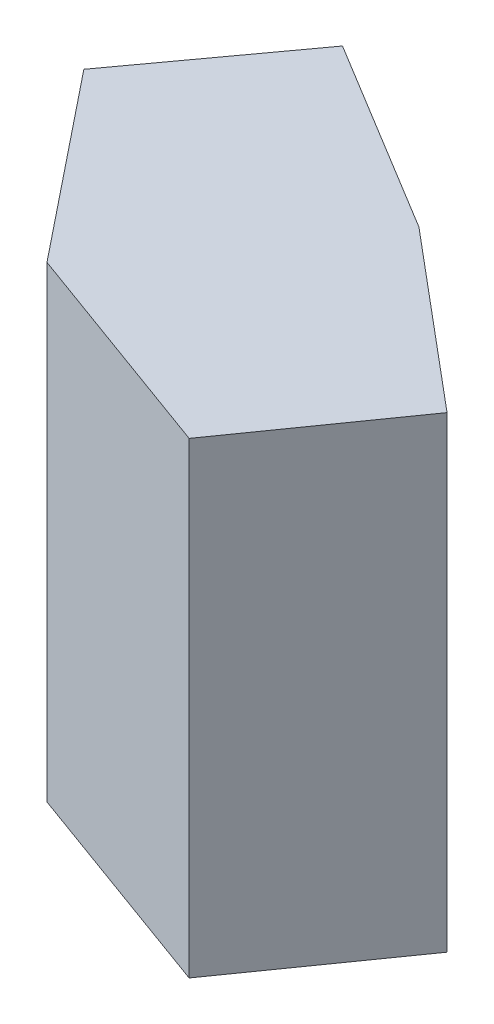
ISO-10303-21;
HEADER;
FILE_DESCRIPTION(('STEP AP214'),'2;1');
FILE_NAME('part.step','',(''),(''),'','','');
FILE_SCHEMA(('AUTOMOTIVE_DESIGN { 1 0 10303 214 1 1 1 1 }'));
ENDSEC;
DATA;
#1=APPLICATION_CONTEXT('core data for automotive mechanical design processes');
#2=APPLICATION_PROTOCOL_DEFINITION('international standard','automotive_design',2000,#1);
#3=PRODUCT_CONTEXT('',#1,'mechanical');
#4=PRODUCT('Part','Part','',(#3));
#5=PRODUCT_RELATED_PRODUCT_CATEGORY('part','',(#4));
#6=PRODUCT_DEFINITION_FORMATION('','',#4);
#7=PRODUCT_DEFINITION_CONTEXT('part definition',#1,'design');
#8=PRODUCT_DEFINITION('design','',#6,#7);
#9=PRODUCT_DEFINITION_SHAPE('','',#8);
#10=(LENGTH_UNIT() NAMED_UNIT(*) SI_UNIT(.MILLI.,.METRE.));
#11=(NAMED_UNIT(*) PLANE_ANGLE_UNIT() SI_UNIT($,.RADIAN.));
#12=(NAMED_UNIT(*) SI_UNIT($,.STERADIAN.) SOLID_ANGLE_UNIT());
#13=UNCERTAINTY_MEASURE_WITH_UNIT(LENGTH_MEASURE(1.E-05),#10,'distance_accuracy_value','');
#14=(GEOMETRIC_REPRESENTATION_CONTEXT(3) GLOBAL_UNCERTAINTY_ASSIGNED_CONTEXT((#13)) GLOBAL_UNIT_ASSIGNED_CONTEXT((#10,
#11,#12)) REPRESENTATION_CONTEXT('',''));
#15=CARTESIAN_POINT('',(0.,0.,0.));
#16=DIRECTION('',(0.,0.,1.));
#17=DIRECTION('',(1.,0.,0.));
#18=AXIS2_PLACEMENT_3D('',#15,#16,#17);
#19=CARTESIAN_POINT('',(-15.9927021240713,6.5,-13.4194704538365));
#20=DIRECTION('',(-0.642787609686546,0.,0.766044443118972));
#21=DIRECTION('',(0.766044443118972,0.,0.642787609686546));
#22=AXIS2_PLACEMENT_3D('',#19,#20,#21);
#23=PLANE('',#22);
#24=DIRECTION('',(-0.766044443118972,0.,-0.642787609686546));
#25=VECTOR('',#24,1.);
#26=CARTESIAN_POINT('',(-15.9927021240713,-6.5,-13.4194704538365));
#27=LINE('',#26,#25);
#28=CARTESIAN_POINT('',(-11.1304941251948,-6.5,-9.33959351527203));
#29=VERTEX_POINT('',#28);
#30=CARTESIAN_POINT('',(-15.9927021240713,-6.5,-13.4194704538365));
#31=VERTEX_POINT('',#30);
#32=EDGE_CURVE('E134',#29,#31,#27,.T.);
#33=ORIENTED_EDGE('',*,*,#32,.T.);
#34=DIRECTION('',(0.,-1.,0.));
#35=VECTOR('',#34,1.);
#36=CARTESIAN_POINT('',(-15.9927021240713,6.5,-13.4194704538365));
#37=LINE('',#36,#35);
#38=CARTESIAN_POINT('',(-15.9927021240713,6.5,-13.4194704538365));
#39=VERTEX_POINT('',#38);
#40=EDGE_CURVE('E131',#39,#31,#37,.T.);
#41=ORIENTED_EDGE('',*,*,#40,.F.);
#42=DIRECTION('',(-0.766044443118972,0.,-0.642787609686546));
#43=VECTOR('',#42,1.);
#44=CARTESIAN_POINT('',(-15.9927021240713,6.5,-13.4194704538365));
#45=LINE('',#44,#43);
#46=CARTESIAN_POINT('',(-11.1304941251948,6.5,-9.33959351527203));
#47=VERTEX_POINT('',#46);
#48=EDGE_CURVE('E79',#47,#39,#45,.T.);
#49=ORIENTED_EDGE('',*,*,#48,.F.);
#50=DIRECTION('',(0.,-1.,0.));
#51=VECTOR('',#50,1.);
#52=CARTESIAN_POINT('',(-11.1304941251948,6.5,-9.33959351527203));
#53=LINE('',#52,#51);
#54=EDGE_CURVE('E47',#47,#29,#53,.T.);
#55=ORIENTED_EDGE('',*,*,#54,.T.);
#56=EDGE_LOOP('',(#33,#41,#49,#55));
#57=FACE_BOUND('',#56,.T.);
#58=ADVANCED_FACE('F39',(#57),#23,.F.);
#59=CARTESIAN_POINT('',(-14.0953893117886,6.5,-5.13030214988513));
#60=DIRECTION('',(0.342020143325676,0.,-0.939692620785906));
#61=DIRECTION('',(-0.939692620785906,0.,-0.342020143325676));
#62=AXIS2_PLACEMENT_3D('',#59,#60,#61);
#63=PLANE('',#62);
#64=DIRECTION('',(0.939692620785906,0.,0.342020143325676));
#65=VECTOR('',#64,1.);
#66=CARTESIAN_POINT('',(-14.0953893117886,-6.5,-5.13030214988513));
#67=LINE('',#66,#65);
#68=CARTESIAN_POINT('',(-20.3143599100768,-6.5,-7.39382233543877));
#69=VERTEX_POINT('',#68);
#70=CARTESIAN_POINT('',(-14.0953893117886,-6.5,-5.13030214988513));
#71=VERTEX_POINT('',#70);
#72=EDGE_CURVE('E69',#69,#71,#67,.T.);
#73=ORIENTED_EDGE('',*,*,#72,.T.);
#74=DIRECTION('',(0.,-1.,0.));
#75=VECTOR('',#74,1.);
#76=CARTESIAN_POINT('',(-14.0953893117886,6.5,-5.13030214988513));
#77=LINE('',#76,#75);
#78=CARTESIAN_POINT('',(-14.0953893117886,6.5,-5.13030214988513));
#79=VERTEX_POINT('',#78);
#80=EDGE_CURVE('E11',#79,#71,#77,.T.);
#81=ORIENTED_EDGE('',*,*,#80,.F.);
#82=DIRECTION('',(0.939692620785906,0.,0.342020143325676));
#83=VECTOR('',#82,1.);
#84=CARTESIAN_POINT('',(-14.0953893117886,6.5,-5.13030214988513));
#85=LINE('',#84,#83);
#86=CARTESIAN_POINT('',(-20.3143599100768,6.5,-7.39382233543877));
#87=VERTEX_POINT('',#86);
#88=EDGE_CURVE('E136',#87,#79,#85,.T.);
#89=ORIENTED_EDGE('',*,*,#88,.F.);
#90=DIRECTION('',(0.,-1.,0.));
#91=VECTOR('',#90,1.);
#92=CARTESIAN_POINT('',(-20.3143599100768,6.5,-7.39382233543876));
#93=LINE('',#92,#91);
#94=EDGE_CURVE('E117',#87,#69,#93,.T.);
#95=ORIENTED_EDGE('',*,*,#94,.T.);
#96=EDGE_LOOP('',(#73,#81,#89,#95));
#97=FACE_BOUND('',#96,.T.);
#98=ADVANCED_FACE('F159',(#97),#63,.F.);
#99=CARTESIAN_POINT('',(-11.1304941251948,6.5,-9.33959351527203));
#100=DIRECTION('',(-0.817550273358289,0.,-0.575857231031952));
#101=DIRECTION('',(-0.575857231031952,0.,0.817550273358289));
#102=AXIS2_PLACEMENT_3D('',#99,#100,#101);
#103=PLANE('',#102);
#104=DIRECTION('',(0.575857231031952,0.,-0.817550273358289));
#105=VECTOR('',#104,1.);
#106=CARTESIAN_POINT('',(-11.1304941251948,-6.5,-9.33959351527203));
#107=LINE('',#106,#105);
#108=EDGE_CURVE('E74',#71,#29,#107,.T.);
#109=ORIENTED_EDGE('',*,*,#108,.T.);
#110=ORIENTED_EDGE('',*,*,#54,.F.);
#111=DIRECTION('',(0.575857231031952,0.,-0.817550273358289));
#112=VECTOR('',#111,1.);
#113=CARTESIAN_POINT('',(-11.1304941251948,6.5,-9.33959351527203));
#114=LINE('',#113,#112);
#115=EDGE_CURVE('E55',#79,#47,#114,.T.);
#116=ORIENTED_EDGE('',*,*,#115,.F.);
#117=ORIENTED_EDGE('',*,*,#80,.T.);
#118=EDGE_LOOP('',(#109,#110,#116,#117));
#119=FACE_BOUND('',#118,.T.);
#120=ADVANCED_FACE('F164',(#119),#103,.F.);
#121=CARTESIAN_POINT('',(0.,6.5,0.));
#122=DIRECTION('',(0.,1.,0.));
#123=DIRECTION('',(0.,0.,1.));
#124=AXIS2_PLACEMENT_3D('',#121,#122,#123);
#125=PLANE('',#124);
#126=ORIENTED_EDGE('',*,*,#48,.T.);
#127=DIRECTION('',(0.854486282532537,0.,0.519473957926405));
#128=VECTOR('',#127,1.);
#129=CARTESIAN_POINT('',(-15.9927021240713,6.5,-13.4194704538365));
#130=LINE('',#129,#128);
#131=CARTESIAN_POINT('',(-21.4162647844098,6.5,-16.716655696972));
#132=VERTEX_POINT('',#131);
#133=EDGE_CURVE('E104',#132,#39,#130,.T.);
#134=ORIENTED_EDGE('',*,*,#133,.F.);
#135=DIRECTION('',(0.589722035990063,0.,-0.807606290383957));
#136=VECTOR('',#135,1.);
#137=CARTESIAN_POINT('',(-21.4162647844098,6.5,-16.716655696972));
#138=LINE('',#137,#136);
#139=CARTESIAN_POINT('',(-24.4525451881514,6.5,-12.5585625551505));
#140=VERTEX_POINT('',#139);
#141=EDGE_CURVE('E97',#140,#132,#138,.T.);
#142=ORIENTED_EDGE('',*,*,#141,.F.);
#143=DIRECTION('',(-0.625283896714666,0.,-0.780397365775489));
#144=VECTOR('',#143,1.);
#145=CARTESIAN_POINT('',(-24.4525451881514,6.5,-12.5585625551505));
#146=LINE('',#145,#144);
#147=EDGE_CURVE('E101',#87,#140,#146,.T.);
#148=ORIENTED_EDGE('',*,*,#147,.F.);
#149=ORIENTED_EDGE('',*,*,#88,.T.);
#150=ORIENTED_EDGE('',*,*,#115,.T.);
#151=EDGE_LOOP('',(#126,#134,#142,#148,#149,#150));
#152=FACE_BOUND('',#151,.T.);
#153=ADVANCED_FACE('F99',(#152),#125,.T.);
#154=CARTESIAN_POINT('',(0.,-6.5,0.));
#155=DIRECTION('',(0.,1.,0.));
#156=DIRECTION('',(0.,0.,1.));
#157=AXIS2_PLACEMENT_3D('',#154,#155,#156);
#158=PLANE('',#157);
#159=ORIENTED_EDGE('',*,*,#32,.F.);
#160=ORIENTED_EDGE('',*,*,#108,.F.);
#161=ORIENTED_EDGE('',*,*,#72,.F.);
#162=DIRECTION('',(-0.625283896714666,0.,-0.780397365775489));
#163=VECTOR('',#162,1.);
#164=CARTESIAN_POINT('',(-24.4525451881514,-6.5,-12.5585625551505));
#165=LINE('',#164,#163);
#166=CARTESIAN_POINT('',(-24.4525451881514,-6.5,-12.5585625551505));
#167=VERTEX_POINT('',#166);
#168=EDGE_CURVE('E126',#69,#167,#165,.T.);
#169=ORIENTED_EDGE('',*,*,#168,.T.);
#170=DIRECTION('',(0.589722035990063,0.,-0.807606290383957));
#171=VECTOR('',#170,1.);
#172=CARTESIAN_POINT('',(-21.4162647844098,-6.5,-16.716655696972));
#173=LINE('',#172,#171);
#174=CARTESIAN_POINT('',(-21.4162647844098,-6.5,-16.716655696972));
#175=VERTEX_POINT('',#174);
#176=EDGE_CURVE('E113',#167,#175,#173,.T.);
#177=ORIENTED_EDGE('',*,*,#176,.T.);
#178=DIRECTION('',(0.854486282532537,0.,0.519473957926405));
#179=VECTOR('',#178,1.);
#180=CARTESIAN_POINT('',(-15.9927021240713,-6.5,-13.4194704538365));
#181=LINE('',#180,#179);
#182=EDGE_CURVE('E123',#175,#31,#181,.T.);
#183=ORIENTED_EDGE('',*,*,#182,.T.);
#184=EDGE_LOOP('',(#159,#160,#161,#169,#177,#183));
#185=FACE_BOUND('',#184,.T.);
#186=ADVANCED_FACE('F144',(#185),#158,.F.);
#187=CARTESIAN_POINT('',(-15.9927021240713,6.5,-13.4194704538365));
#188=DIRECTION('',(-0.519473957926406,0.,0.854486282532537));
#189=DIRECTION('',(-0.854486282532537,0.,-0.519473957926405));
#190=AXIS2_PLACEMENT_3D('',#187,#188,#189);
#191=PLANE('',#190);
#192=ORIENTED_EDGE('',*,*,#182,.F.);
#193=DIRECTION('',(0.,-1.,0.));
#194=VECTOR('',#193,1.);
#195=CARTESIAN_POINT('',(-21.4162647844098,6.5,-16.716655696972));
#196=LINE('',#195,#194);
#197=EDGE_CURVE('E108',#132,#175,#196,.T.);
#198=ORIENTED_EDGE('',*,*,#197,.F.);
#199=ORIENTED_EDGE('',*,*,#133,.T.);
#200=ORIENTED_EDGE('',*,*,#40,.T.);
#201=EDGE_LOOP('',(#192,#198,#199,#200));
#202=FACE_BOUND('',#201,.T.);
#203=ADVANCED_FACE('F147',(#202),#191,.F.);
#204=CARTESIAN_POINT('',(-24.4525451881514,6.5,-12.5585625551505));
#205=DIRECTION('',(0.780397365775489,0.,-0.625283896714666));
#206=DIRECTION('',(0.625283896714666,0.,0.78039736577549));
#207=AXIS2_PLACEMENT_3D('',#204,#205,#206);
#208=PLANE('',#207);
#209=ORIENTED_EDGE('',*,*,#168,.F.);
#210=ORIENTED_EDGE('',*,*,#94,.F.);
#211=ORIENTED_EDGE('',*,*,#147,.T.);
#212=DIRECTION('',(0.,-1.,0.));
#213=VECTOR('',#212,1.);
#214=CARTESIAN_POINT('',(-24.4525451881514,6.5,-12.5585625551505));
#215=LINE('',#214,#213);
#216=EDGE_CURVE('E111',#140,#167,#215,.T.);
#217=ORIENTED_EDGE('',*,*,#216,.T.);
#218=EDGE_LOOP('',(#209,#210,#211,#217));
#219=FACE_BOUND('',#218,.T.);
#220=ADVANCED_FACE('F119',(#219),#208,.F.);
#221=CARTESIAN_POINT('',(-21.4162647844098,6.5,-16.716655696972));
#222=DIRECTION('',(0.807606290383956,0.,0.589722035990063));
#223=DIRECTION('',(-0.589722035990063,0.,0.807606290383957));
#224=AXIS2_PLACEMENT_3D('',#221,#222,#223);
#225=PLANE('',#224);
#226=ORIENTED_EDGE('',*,*,#176,.F.);
#227=ORIENTED_EDGE('',*,*,#216,.F.);
#228=ORIENTED_EDGE('',*,*,#141,.T.);
#229=ORIENTED_EDGE('',*,*,#197,.T.);
#230=EDGE_LOOP('',(#226,#227,#228,#229));
#231=FACE_BOUND('',#230,.T.);
#232=ADVANCED_FACE('F112',(#231),#225,.F.);
#233=CLOSED_SHELL('',(#58,#98,#120,#153,#186,#203,#220,#232));
#234=MANIFOLD_SOLID_BREP('B2',#233);
#235=ADVANCED_BREP_SHAPE_REPRESENTATION('',(#18,#234),#14);
#236=SHAPE_DEFINITION_REPRESENTATION(#9,#235);
ENDSEC;
END-ISO-10303-21;
